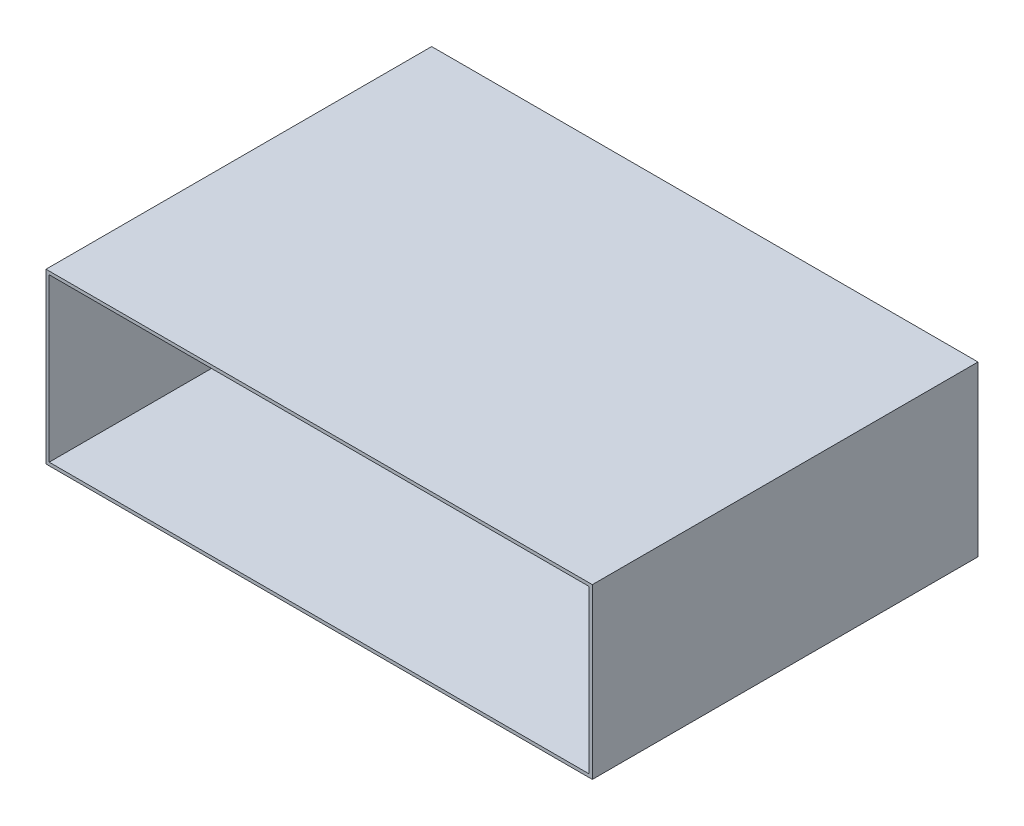
ISO-10303-21;
HEADER;
FILE_DESCRIPTION(('STEP AP214'),'2;1');
FILE_NAME('part.step','',(''),(''),'','','');
FILE_SCHEMA(('AUTOMOTIVE_DESIGN { 1 0 10303 214 1 1 1 1 }'));
ENDSEC;
DATA;
#1=APPLICATION_CONTEXT('core data for automotive mechanical design processes');
#2=APPLICATION_PROTOCOL_DEFINITION('international standard','automotive_design',2000,#1);
#3=PRODUCT_CONTEXT('',#1,'mechanical');
#4=PRODUCT('Part','Part','',(#3));
#5=PRODUCT_RELATED_PRODUCT_CATEGORY('part','',(#4));
#6=PRODUCT_DEFINITION_FORMATION('','',#4);
#7=PRODUCT_DEFINITION_CONTEXT('part definition',#1,'design');
#8=PRODUCT_DEFINITION('design','',#6,#7);
#9=PRODUCT_DEFINITION_SHAPE('','',#8);
#10=(LENGTH_UNIT() NAMED_UNIT(*) SI_UNIT(.MILLI.,.METRE.));
#11=(NAMED_UNIT(*) PLANE_ANGLE_UNIT() SI_UNIT($,.RADIAN.));
#12=(NAMED_UNIT(*) SI_UNIT($,.STERADIAN.) SOLID_ANGLE_UNIT());
#13=UNCERTAINTY_MEASURE_WITH_UNIT(LENGTH_MEASURE(1.E-05),#10,'distance_accuracy_value','');
#14=(GEOMETRIC_REPRESENTATION_CONTEXT(3) GLOBAL_UNCERTAINTY_ASSIGNED_CONTEXT((#13)) GLOBAL_UNIT_ASSIGNED_CONTEXT((#10,
#11,#12)) REPRESENTATION_CONTEXT('',''));
#15=CARTESIAN_POINT('',(0.,0.,0.));
#16=DIRECTION('',(0.,0.,1.));
#17=DIRECTION('',(1.,0.,0.));
#18=AXIS2_PLACEMENT_3D('',#15,#16,#17);
#19=CARTESIAN_POINT('',(215.9,133.35,-152.4));
#20=DIRECTION('',(-1.,0.,0.));
#21=DIRECTION('',(0.,0.,1.));
#22=AXIS2_PLACEMENT_3D('',#19,#20,#21);
#23=PLANE('',#22);
#24=DIRECTION('',(0.,0.,-1.));
#25=VECTOR('',#24,1.);
#26=CARTESIAN_POINT('',(215.9,0.,-152.4));
#27=LINE('',#26,#25);
#28=CARTESIAN_POINT('',(215.9,0.,152.4));
#29=VERTEX_POINT('',#28);
#30=CARTESIAN_POINT('',(215.9,0.,-152.4));
#31=VERTEX_POINT('',#30);
#32=EDGE_CURVE('E127',#29,#31,#27,.T.);
#33=ORIENTED_EDGE('',*,*,#32,.T.);
#34=DIRECTION('',(0.,-1.,0.));
#35=VECTOR('',#34,1.);
#36=CARTESIAN_POINT('',(215.9,133.35,-152.4));
#37=LINE('',#36,#35);
#38=CARTESIAN_POINT('',(215.9,133.35,-152.4));
#39=VERTEX_POINT('',#38);
#40=EDGE_CURVE('E11',#39,#31,#37,.T.);
#41=ORIENTED_EDGE('',*,*,#40,.F.);
#42=DIRECTION('',(0.,0.,-1.));
#43=VECTOR('',#42,1.);
#44=CARTESIAN_POINT('',(215.9,133.35,-152.4));
#45=LINE('',#44,#43);
#46=CARTESIAN_POINT('',(215.9,133.35,152.4));
#47=VERTEX_POINT('',#46);
#48=EDGE_CURVE('E137',#47,#39,#45,.T.);
#49=ORIENTED_EDGE('',*,*,#48,.F.);
#50=DIRECTION('',(0.,-1.,0.));
#51=VECTOR('',#50,1.);
#52=CARTESIAN_POINT('',(215.9,133.35,152.4));
#53=LINE('',#52,#51);
#54=EDGE_CURVE('E142',#47,#29,#53,.T.);
#55=ORIENTED_EDGE('',*,*,#54,.T.);
#56=EDGE_LOOP('',(#33,#41,#49,#55));
#57=FACE_BOUND('',#56,.T.);
#58=ADVANCED_FACE('F32',(#57),#23,.F.);
#59=CARTESIAN_POINT('',(-215.9,133.35,-152.4));
#60=DIRECTION('',(0.,0.,1.));
#61=DIRECTION('',(1.,0.,0.));
#62=AXIS2_PLACEMENT_3D('',#59,#60,#61);
#63=PLANE('',#62);
#64=DIRECTION('',(-1.,0.,0.));
#65=VECTOR('',#64,1.);
#66=CARTESIAN_POINT('',(-215.9,0.,-152.4));
#67=LINE('',#66,#65);
#68=CARTESIAN_POINT('',(-215.9,0.,-152.4));
#69=VERTEX_POINT('',#68);
#70=EDGE_CURVE('E131',#31,#69,#67,.T.);
#71=ORIENTED_EDGE('',*,*,#70,.T.);
#72=DIRECTION('',(0.,-1.,0.));
#73=VECTOR('',#72,1.);
#74=CARTESIAN_POINT('',(-215.9,133.35,-152.4));
#75=LINE('',#74,#73);
#76=CARTESIAN_POINT('',(-215.9,133.35,-152.4));
#77=VERTEX_POINT('',#76);
#78=EDGE_CURVE('E39',#77,#69,#75,.T.);
#79=ORIENTED_EDGE('',*,*,#78,.F.);
#80=DIRECTION('',(-1.,0.,0.));
#81=VECTOR('',#80,1.);
#82=CARTESIAN_POINT('',(-215.9,133.35,-152.4));
#83=LINE('',#82,#81);
#84=EDGE_CURVE('E83',#39,#77,#83,.T.);
#85=ORIENTED_EDGE('',*,*,#84,.F.);
#86=ORIENTED_EDGE('',*,*,#40,.T.);
#87=EDGE_LOOP('',(#71,#79,#85,#86));
#88=FACE_BOUND('',#87,.T.);
#89=ADVANCED_FACE('F170',(#88),#63,.F.);
#90=CARTESIAN_POINT('',(-215.9,133.35,-152.4));
#91=DIRECTION('',(1.,0.,0.));
#92=DIRECTION('',(0.,0.,-1.));
#93=AXIS2_PLACEMENT_3D('',#90,#91,#92);
#94=PLANE('',#93);
#95=DIRECTION('',(0.,0.,1.));
#96=VECTOR('',#95,1.);
#97=CARTESIAN_POINT('',(-215.9,0.,-152.4));
#98=LINE('',#97,#96);
#99=CARTESIAN_POINT('',(-215.9,0.,152.4));
#100=VERTEX_POINT('',#99);
#101=EDGE_CURVE('E145',#69,#100,#98,.T.);
#102=ORIENTED_EDGE('',*,*,#101,.T.);
#103=DIRECTION('',(0.,-1.,0.));
#104=VECTOR('',#103,1.);
#105=CARTESIAN_POINT('',(-215.9,133.35,152.4));
#106=LINE('',#105,#104);
#107=CARTESIAN_POINT('',(-215.9,133.35,152.4));
#108=VERTEX_POINT('',#107);
#109=EDGE_CURVE('E149',#108,#100,#106,.T.);
#110=ORIENTED_EDGE('',*,*,#109,.F.);
#111=DIRECTION('',(0.,0.,1.));
#112=VECTOR('',#111,1.);
#113=CARTESIAN_POINT('',(-215.9,133.35,-152.4));
#114=LINE('',#113,#112);
#115=EDGE_CURVE('E140',#77,#108,#114,.T.);
#116=ORIENTED_EDGE('',*,*,#115,.F.);
#117=ORIENTED_EDGE('',*,*,#78,.T.);
#118=EDGE_LOOP('',(#102,#110,#116,#117));
#119=FACE_BOUND('',#118,.T.);
#120=ADVANCED_FACE('F154',(#119),#94,.F.);
#121=CARTESIAN_POINT('',(-215.9,133.35,152.4));
#122=DIRECTION('',(0.,0.,-1.));
#123=DIRECTION('',(-1.,0.,0.));
#124=AXIS2_PLACEMENT_3D('',#121,#122,#123);
#125=PLANE('',#124);
#126=DIRECTION('',(0.,-1.,0.));
#127=VECTOR('',#126,1.);
#128=CARTESIAN_POINT('',(-213.36,130.81,152.4));
#129=LINE('',#128,#127);
#130=CARTESIAN_POINT('',(-213.36,130.81,152.4));
#131=VERTEX_POINT('',#130);
#132=CARTESIAN_POINT('',(-213.36,2.53999999999999,152.4));
#133=VERTEX_POINT('',#132);
#134=EDGE_CURVE('E119',#131,#133,#129,.T.);
#135=ORIENTED_EDGE('',*,*,#134,.F.);
#136=DIRECTION('',(1.,0.,0.));
#137=VECTOR('',#136,1.);
#138=CARTESIAN_POINT('',(213.36,130.81,152.4));
#139=LINE('',#138,#137);
#140=CARTESIAN_POINT('',(213.36,130.81,152.4));
#141=VERTEX_POINT('',#140);
#142=EDGE_CURVE('E106',#131,#141,#139,.T.);
#143=ORIENTED_EDGE('',*,*,#142,.T.);
#144=DIRECTION('',(0.,-1.,0.));
#145=VECTOR('',#144,1.);
#146=CARTESIAN_POINT('',(213.36,130.81,152.4));
#147=LINE('',#146,#145);
#148=CARTESIAN_POINT('',(213.36,2.54,152.4));
#149=VERTEX_POINT('',#148);
#150=EDGE_CURVE('E128',#141,#149,#147,.T.);
#151=ORIENTED_EDGE('',*,*,#150,.T.);
#152=DIRECTION('',(1.,0.,0.));
#153=VECTOR('',#152,1.);
#154=CARTESIAN_POINT('',(213.36,2.54,152.4));
#155=LINE('',#154,#153);
#156=EDGE_CURVE('E126',#133,#149,#155,.T.);
#157=ORIENTED_EDGE('',*,*,#156,.F.);
#158=EDGE_LOOP('',(#135,#143,#151,#157));
#159=FACE_BOUND('',#158,.T.);
#160=DIRECTION('',(1.,0.,0.));
#161=VECTOR('',#160,1.);
#162=CARTESIAN_POINT('',(-215.9,0.,152.4));
#163=LINE('',#162,#161);
#164=EDGE_CURVE('E76',#100,#29,#163,.T.);
#165=ORIENTED_EDGE('',*,*,#164,.T.);
#166=ORIENTED_EDGE('',*,*,#54,.F.);
#167=DIRECTION('',(1.,0.,0.));
#168=VECTOR('',#167,1.);
#169=CARTESIAN_POINT('',(-215.9,133.35,152.4));
#170=LINE('',#169,#168);
#171=EDGE_CURVE('E55',#108,#47,#170,.T.);
#172=ORIENTED_EDGE('',*,*,#171,.F.);
#173=ORIENTED_EDGE('',*,*,#109,.T.);
#174=EDGE_LOOP('',(#165,#166,#172,#173));
#175=FACE_BOUND('',#174,.T.);
#176=ADVANCED_FACE('F125',(#159,#175),#125,.F.);
#177=CARTESIAN_POINT('',(0.,133.35,0.));
#178=DIRECTION('',(0.,1.,0.));
#179=DIRECTION('',(0.,0.,1.));
#180=AXIS2_PLACEMENT_3D('',#177,#178,#179);
#181=PLANE('',#180);
#182=ORIENTED_EDGE('',*,*,#48,.T.);
#183=ORIENTED_EDGE('',*,*,#84,.T.);
#184=ORIENTED_EDGE('',*,*,#115,.T.);
#185=ORIENTED_EDGE('',*,*,#171,.T.);
#186=EDGE_LOOP('',(#182,#183,#184,#185));
#187=FACE_BOUND('',#186,.T.);
#188=ADVANCED_FACE('F163',(#187),#181,.T.);
#189=CARTESIAN_POINT('',(0.,0.,0.));
#190=DIRECTION('',(0.,1.,0.));
#191=DIRECTION('',(0.,0.,1.));
#192=AXIS2_PLACEMENT_3D('',#189,#190,#191);
#193=PLANE('',#192);
#194=ORIENTED_EDGE('',*,*,#32,.F.);
#195=ORIENTED_EDGE('',*,*,#164,.F.);
#196=ORIENTED_EDGE('',*,*,#101,.F.);
#197=ORIENTED_EDGE('',*,*,#70,.F.);
#198=EDGE_LOOP('',(#194,#195,#196,#197));
#199=FACE_BOUND('',#198,.T.);
#200=ADVANCED_FACE('F158',(#199),#193,.F.);
#201=CARTESIAN_POINT('',(-213.36,130.81,152.4));
#202=DIRECTION('',(1.,0.,0.));
#203=DIRECTION('',(0.,0.,-1.));
#204=AXIS2_PLACEMENT_3D('',#201,#202,#203);
#205=PLANE('',#204);
#206=DIRECTION('',(0.,0.,1.));
#207=VECTOR('',#206,1.);
#208=CARTESIAN_POINT('',(-213.36,2.54,152.4));
#209=LINE('',#208,#207);
#210=CARTESIAN_POINT('',(-213.36,2.54,-149.86));
#211=VERTEX_POINT('',#210);
#212=EDGE_CURVE('E46',#211,#133,#209,.T.);
#213=ORIENTED_EDGE('',*,*,#212,.F.);
#214=DIRECTION('',(0.,-1.,0.));
#215=VECTOR('',#214,1.);
#216=CARTESIAN_POINT('',(-213.36,130.81,-149.86));
#217=LINE('',#216,#215);
#218=CARTESIAN_POINT('',(-213.36,130.81,-149.86));
#219=VERTEX_POINT('',#218);
#220=EDGE_CURVE('E122',#219,#211,#217,.T.);
#221=ORIENTED_EDGE('',*,*,#220,.F.);
#222=DIRECTION('',(0.,0.,1.));
#223=VECTOR('',#222,1.);
#224=CARTESIAN_POINT('',(-213.36,130.81,152.4));
#225=LINE('',#224,#223);
#226=EDGE_CURVE('E110',#219,#131,#225,.T.);
#227=ORIENTED_EDGE('',*,*,#226,.T.);
#228=ORIENTED_EDGE('',*,*,#134,.T.);
#229=EDGE_LOOP('',(#213,#221,#227,#228));
#230=FACE_BOUND('',#229,.T.);
#231=ADVANCED_FACE('F118',(#230),#205,.T.);
#232=CARTESIAN_POINT('',(213.36,130.81,152.4));
#233=DIRECTION('',(-1.,0.,0.));
#234=DIRECTION('',(0.,0.,1.));
#235=AXIS2_PLACEMENT_3D('',#232,#233,#234);
#236=PLANE('',#235);
#237=DIRECTION('',(0.,0.,-1.));
#238=VECTOR('',#237,1.);
#239=CARTESIAN_POINT('',(213.36,2.54,152.4));
#240=LINE('',#239,#238);
#241=CARTESIAN_POINT('',(213.36,2.54,-149.86));
#242=VERTEX_POINT('',#241);
#243=EDGE_CURVE('E252',#149,#242,#240,.T.);
#244=ORIENTED_EDGE('',*,*,#243,.F.);
#245=ORIENTED_EDGE('',*,*,#150,.F.);
#246=DIRECTION('',(0.,0.,-1.));
#247=VECTOR('',#246,1.);
#248=CARTESIAN_POINT('',(213.36,130.81,152.4));
#249=LINE('',#248,#247);
#250=CARTESIAN_POINT('',(213.36,130.81,-149.86));
#251=VERTEX_POINT('',#250);
#252=EDGE_CURVE('E111',#141,#251,#249,.T.);
#253=ORIENTED_EDGE('',*,*,#252,.T.);
#254=DIRECTION('',(0.,-1.,0.));
#255=VECTOR('',#254,1.);
#256=CARTESIAN_POINT('',(213.36,130.81,-149.86));
#257=LINE('',#256,#255);
#258=EDGE_CURVE('E133',#251,#242,#257,.T.);
#259=ORIENTED_EDGE('',*,*,#258,.T.);
#260=EDGE_LOOP('',(#244,#245,#253,#259));
#261=FACE_BOUND('',#260,.T.);
#262=ADVANCED_FACE('F209',(#261),#236,.T.);
#263=CARTESIAN_POINT('',(213.36,130.81,-149.86));
#264=DIRECTION('',(0.,0.,1.));
#265=DIRECTION('',(1.,0.,0.));
#266=AXIS2_PLACEMENT_3D('',#263,#264,#265);
#267=PLANE('',#266);
#268=DIRECTION('',(-1.,0.,0.));
#269=VECTOR('',#268,1.);
#270=CARTESIAN_POINT('',(213.36,2.54,-149.86));
#271=LINE('',#270,#269);
#272=EDGE_CURVE('E123',#242,#211,#271,.T.);
#273=ORIENTED_EDGE('',*,*,#272,.F.);
#274=ORIENTED_EDGE('',*,*,#258,.F.);
#275=DIRECTION('',(-1.,0.,0.));
#276=VECTOR('',#275,1.);
#277=CARTESIAN_POINT('',(213.36,130.81,-149.86));
#278=LINE('',#277,#276);
#279=EDGE_CURVE('E257',#251,#219,#278,.T.);
#280=ORIENTED_EDGE('',*,*,#279,.T.);
#281=ORIENTED_EDGE('',*,*,#220,.T.);
#282=EDGE_LOOP('',(#273,#274,#280,#281));
#283=FACE_BOUND('',#282,.T.);
#284=ADVANCED_FACE('F218',(#283),#267,.T.);
#285=CARTESIAN_POINT('',(0.,130.81,0.));
#286=DIRECTION('',(0.,1.,0.));
#287=DIRECTION('',(0.,0.,1.));
#288=AXIS2_PLACEMENT_3D('',#285,#286,#287);
#289=PLANE('',#288);
#290=ORIENTED_EDGE('',*,*,#226,.F.);
#291=ORIENTED_EDGE('',*,*,#279,.F.);
#292=ORIENTED_EDGE('',*,*,#252,.F.);
#293=ORIENTED_EDGE('',*,*,#142,.F.);
#294=EDGE_LOOP('',(#290,#291,#292,#293));
#295=FACE_BOUND('',#294,.T.);
#296=ADVANCED_FACE('F108',(#295),#289,.F.);
#297=CARTESIAN_POINT('',(0.,2.54,0.));
#298=DIRECTION('',(0.,1.,0.));
#299=DIRECTION('',(0.,0.,1.));
#300=AXIS2_PLACEMENT_3D('',#297,#298,#299);
#301=PLANE('',#300);
#302=ORIENTED_EDGE('',*,*,#212,.T.);
#303=ORIENTED_EDGE('',*,*,#156,.T.);
#304=ORIENTED_EDGE('',*,*,#243,.T.);
#305=ORIENTED_EDGE('',*,*,#272,.T.);
#306=EDGE_LOOP('',(#302,#303,#304,#305));
#307=FACE_BOUND('',#306,.T.);
#308=ADVANCED_FACE('F237',(#307),#301,.T.);
#309=CLOSED_SHELL('',(#58,#89,#120,#176,#188,#200,#231,#262,#284,#296,#308));
#310=MANIFOLD_SOLID_BREP('B2',#309);
#311=ADVANCED_BREP_SHAPE_REPRESENTATION('',(#18,#310),#14);
#312=SHAPE_DEFINITION_REPRESENTATION(#9,#311);
ENDSEC;
END-ISO-10303-21;
